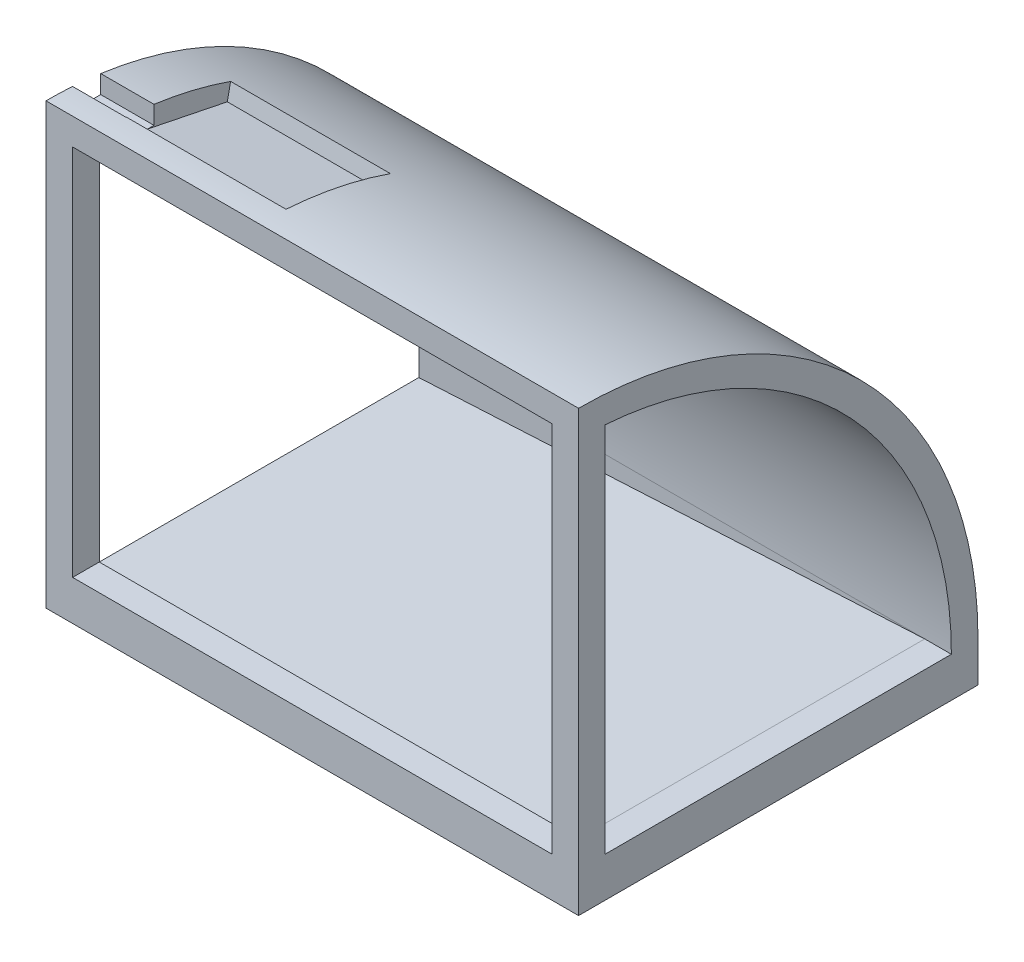
ISO-10303-21;
HEADER;
FILE_DESCRIPTION(('STEP AP214'),'2;1');
FILE_NAME('part.step','',(''),(''),'','','');
FILE_SCHEMA(('AUTOMOTIVE_DESIGN { 1 0 10303 214 1 1 1 1 }'));
ENDSEC;
DATA;
#1=APPLICATION_CONTEXT('core data for automotive mechanical design processes');
#2=APPLICATION_PROTOCOL_DEFINITION('international standard','automotive_design',2000,#1);
#3=PRODUCT_CONTEXT('',#1,'mechanical');
#4=PRODUCT('Part','Part','',(#3));
#5=PRODUCT_RELATED_PRODUCT_CATEGORY('part','',(#4));
#6=PRODUCT_DEFINITION_FORMATION('','',#4);
#7=PRODUCT_DEFINITION_CONTEXT('part definition',#1,'design');
#8=PRODUCT_DEFINITION('design','',#6,#7);
#9=PRODUCT_DEFINITION_SHAPE('','',#8);
#10=(LENGTH_UNIT() NAMED_UNIT(*) SI_UNIT(.MILLI.,.METRE.));
#11=(NAMED_UNIT(*) PLANE_ANGLE_UNIT() SI_UNIT($,.RADIAN.));
#12=(NAMED_UNIT(*) SI_UNIT($,.STERADIAN.) SOLID_ANGLE_UNIT());
#13=UNCERTAINTY_MEASURE_WITH_UNIT(LENGTH_MEASURE(1.E-05),#10,'distance_accuracy_value','');
#14=(GEOMETRIC_REPRESENTATION_CONTEXT(3) GLOBAL_UNCERTAINTY_ASSIGNED_CONTEXT((#13)) GLOBAL_UNIT_ASSIGNED_CONTEXT((#10,
#11,#12)) REPRESENTATION_CONTEXT('',''));
#15=CARTESIAN_POINT('',(0.,0.,0.));
#16=DIRECTION('',(0.,0.,1.));
#17=DIRECTION('',(1.,0.,0.));
#18=AXIS2_PLACEMENT_3D('',#15,#16,#17);
#19=CARTESIAN_POINT('',(-100.,-15.,0.));
#20=DIRECTION('',(-1.,0.,0.));
#21=DIRECTION('',(0.,0.,1.));
#22=AXIS2_PLACEMENT_3D('',#19,#20,#21);
#23=PLANE('',#22);
#24=DIRECTION('',(0.,0.,1.));
#25=VECTOR('',#24,1.);
#26=CARTESIAN_POINT('',(-100.,-10.,-65.));
#27=LINE('',#26,#25);
#28=CARTESIAN_POINT('',(-100.,-10.,-65.));
#29=VERTEX_POINT('',#28);
#30=CARTESIAN_POINT('',(-100.,-10.,65.0000000000001));
#31=VERTEX_POINT('',#30);
#32=EDGE_CURVE('E445',#29,#31,#27,.T.);
#33=ORIENTED_EDGE('',*,*,#32,.F.);
#34=DIRECTION('',(0.,-1.,0.));
#35=VECTOR('',#34,1.);
#36=CARTESIAN_POINT('',(-100.,0.,-65.));
#37=LINE('',#36,#35);
#38=CARTESIAN_POINT('',(-100.,0.,-65.));
#39=VERTEX_POINT('',#38);
#40=EDGE_CURVE('E436',#39,#29,#37,.T.);
#41=ORIENTED_EDGE('',*,*,#40,.F.);
#42=CARTESIAN_POINT('',(-100.,0.,75.));
#43=DIRECTION('',(-1.,0.,0.));
#44=DIRECTION('',(0.,0.,1.));
#45=AXIS2_PLACEMENT_3D('',#42,#43,#44);
#46=CIRCLE('',#45,140.);
#47=CARTESIAN_POINT('',(-100.,139.642400437689,65.0000000000001));
#48=VERTEX_POINT('',#47);
#49=EDGE_CURVE('E519',#48,#39,#46,.T.);
#50=ORIENTED_EDGE('',*,*,#49,.F.);
#51=DIRECTION('',(0.,-1.,0.));
#52=VECTOR('',#51,1.);
#53=CARTESIAN_POINT('',(-100.,150.001,65.0000000000001));
#54=LINE('',#53,#52);
#55=EDGE_CURVE('E497',#48,#31,#54,.T.);
#56=ORIENTED_EDGE('',*,*,#55,.T.);
#57=EDGE_LOOP('',(#33,#41,#50,#56));
#58=FACE_BOUND('',#57,.T.);
#59=CARTESIAN_POINT('',(-100.,0.,75.));
#60=DIRECTION('',(-1.,0.,0.));
#61=DIRECTION('',(0.,0.,1.));
#62=AXIS2_PLACEMENT_3D('',#59,#60,#61);
#63=CIRCLE('',#62,150.);
#64=CARTESIAN_POINT('',(-100.,150.,75.0000000000005));
#65=VERTEX_POINT('',#64);
#66=CARTESIAN_POINT('',(-100.,149.666295470958,65.000000000009));
#67=VERTEX_POINT('',#66);
#68=EDGE_CURVE('E524',#65,#67,#63,.T.);
#69=ORIENTED_EDGE('',*,*,#68,.T.);
#70=DIRECTION('',(0.,-1.,0.));
#71=VECTOR('',#70,1.);
#72=CARTESIAN_POINT('',(-100.,-15.,65.000000000009));
#73=LINE('',#72,#71);
#74=CARTESIAN_POINT('',(-100.,141.751920101458,65.000000000009));
#75=VERTEX_POINT('',#74);
#76=EDGE_CURVE('E392',#67,#75,#73,.T.);
#77=ORIENTED_EDGE('',*,*,#76,.T.);
#78=DIRECTION('',(0.,0.,-1.));
#79=VECTOR('',#78,1.);
#80=CARTESIAN_POINT('',(-100.,141.751920101458,0.));
#81=LINE('',#80,#79);
#82=CARTESIAN_POINT('',(-100.,141.751920101458,54.4540349132148));
#83=VERTEX_POINT('',#82);
#84=EDGE_CURVE('E366',#75,#83,#81,.T.);
#85=ORIENTED_EDGE('',*,*,#84,.T.);
#86=DIRECTION('',(0.,-1.,0.));
#87=VECTOR('',#86,1.);
#88=CARTESIAN_POINT('',(-100.,-15.,54.4540349132148));
#89=LINE('',#88,#87);
#90=CARTESIAN_POINT('',(-100.,148.586215103059,54.4540349132148));
#91=VERTEX_POINT('',#90);
#92=EDGE_CURVE('E370',#91,#83,#89,.T.);
#93=ORIENTED_EDGE('',*,*,#92,.F.);
#94=CARTESIAN_POINT('',(-100.,0.,-75.));
#95=VERTEX_POINT('',#94);
#96=EDGE_CURVE('E523',#91,#95,#63,.T.);
#97=ORIENTED_EDGE('',*,*,#96,.T.);
#98=DIRECTION('',(0.,1.,0.));
#99=VECTOR('',#98,1.);
#100=CARTESIAN_POINT('',(-100.,-15.,-75.));
#101=LINE('',#100,#99);
#102=CARTESIAN_POINT('',(-100.,-15.,-75.));
#103=VERTEX_POINT('',#102);
#104=EDGE_CURVE('E562',#103,#95,#101,.T.);
#105=ORIENTED_EDGE('',*,*,#104,.F.);
#106=DIRECTION('',(0.,0.,1.));
#107=VECTOR('',#106,1.);
#108=CARTESIAN_POINT('',(-100.,-15.,0.));
#109=LINE('',#108,#107);
#110=CARTESIAN_POINT('',(-100.,-15.,75.));
#111=VERTEX_POINT('',#110);
#112=EDGE_CURVE('E548',#103,#111,#109,.T.);
#113=ORIENTED_EDGE('',*,*,#112,.T.);
#114=DIRECTION('',(0.,1.,0.));
#115=VECTOR('',#114,1.);
#116=CARTESIAN_POINT('',(-100.,-15.,75.));
#117=LINE('',#116,#115);
#118=EDGE_CURVE('E556',#111,#65,#117,.T.);
#119=ORIENTED_EDGE('',*,*,#118,.T.);
#120=EDGE_LOOP('',(#69,#77,#85,#93,#97,#105,#113,#119));
#121=FACE_BOUND('',#120,.T.);
#122=ADVANCED_FACE('F205',(#58,#121),#23,.T.);
#123=CARTESIAN_POINT('',(-80.,0.,0.));
#124=DIRECTION('',(-1.,0.,0.));
#125=DIRECTION('',(0.,0.,1.));
#126=AXIS2_PLACEMENT_3D('',#123,#124,#125);
#127=PLANE('',#126);
#128=DIRECTION('',(0.,-1.,0.));
#129=VECTOR('',#128,1.);
#130=CARTESIAN_POINT('',(-80.,0.,65.000000000009));
#131=LINE('',#130,#129);
#132=CARTESIAN_POINT('',(-80.,148.989794855622,65.000000000009));
#133=VERTEX_POINT('',#132);
#134=CARTESIAN_POINT('',(-80.,143.397212025434,65.000000000009));
#135=VERTEX_POINT('',#134);
#136=EDGE_CURVE('E12',#133,#135,#131,.T.);
#137=ORIENTED_EDGE('',*,*,#136,.F.);
#138=DIRECTION('',(0.,0.979795897113272,-0.199999999999997));
#139=VECTOR('',#138,1.);
#140=CARTESIAN_POINT('',(-80.,18.6969384566988,91.5959179422656));
#141=LINE('',#140,#139);
#142=CARTESIAN_POINT('',(-80.,143.620915338641,66.0959179422659));
#143=VERTEX_POINT('',#142);
#144=EDGE_CURVE('E410',#143,#133,#141,.T.);
#145=ORIENTED_EDGE('',*,*,#144,.F.);
#146=DIRECTION('',(0.,-0.199999999999997,-0.979795897113272));
#147=VECTOR('',#146,1.);
#148=CARTESIAN_POINT('',(-80.,124.923976881942,-25.4999999999997));
#149=LINE('',#148,#147);
#150=EDGE_CURVE('E421',#143,#135,#149,.T.);
#151=ORIENTED_EDGE('',*,*,#150,.T.);
#152=EDGE_LOOP('',(#137,#145,#151));
#153=FACE_BOUND('',#152,.T.);
#154=ADVANCED_FACE('F668',(#153),#127,.F.);
#155=DIRECTION('',(0.,0.,1.));
#156=VECTOR('',#155,1.);
#157=CARTESIAN_POINT('',(-80.,141.751920101458,0.));
#158=LINE('',#157,#156);
#159=CARTESIAN_POINT('',(-80.,141.751920101458,54.4540349132148));
#160=VERTEX_POINT('',#159);
#161=CARTESIAN_POINT('',(-80.,141.751920101458,56.9397486166852));
#162=VERTEX_POINT('',#161);
#163=EDGE_CURVE('E221',#160,#162,#158,.T.);
#164=ORIENTED_EDGE('',*,*,#163,.T.);
#165=CARTESIAN_POINT('',(-80.,135.620915338641,26.904082057735));
#166=VERTEX_POINT('',#165);
#167=EDGE_CURVE('E420',#162,#166,#149,.T.);
#168=ORIENTED_EDGE('',*,*,#167,.T.);
#169=DIRECTION('',(0.,0.979795897113272,-0.199999999999997));
#170=VECTOR('',#169,1.);
#171=CARTESIAN_POINT('',(-80.,10.6969384566989,52.4040820577347));
#172=LINE('',#171,#170);
#173=CARTESIAN_POINT('',(-80.,141.657131648265,25.671944563098));
#174=VERTEX_POINT('',#173);
#175=EDGE_CURVE('E229',#166,#174,#172,.T.);
#176=ORIENTED_EDGE('',*,*,#175,.T.);
#177=CARTESIAN_POINT('',(-80.,0.,75.));
#178=DIRECTION('',(-1.,0.,0.));
#179=DIRECTION('',(0.,0.,1.));
#180=AXIS2_PLACEMENT_3D('',#177,#178,#179);
#181=CIRCLE('',#180,150.);
#182=CARTESIAN_POINT('',(-80.,148.586215103059,54.4540349132148));
#183=VERTEX_POINT('',#182);
#184=EDGE_CURVE('E566',#174,#183,#181,.F.);
#185=ORIENTED_EDGE('',*,*,#184,.T.);
#186=DIRECTION('',(0.,1.,0.));
#187=VECTOR('',#186,1.);
#188=CARTESIAN_POINT('',(-80.,0.,54.4540349132148));
#189=LINE('',#188,#187);
#190=EDGE_CURVE('E377',#160,#183,#189,.T.);
#191=ORIENTED_EDGE('',*,*,#190,.F.);
#192=EDGE_LOOP('',(#164,#168,#176,#185,#191));
#193=FACE_BOUND('',#192,.T.);
#194=ADVANCED_FACE('F609',(#193),#127,.F.);
#195=CARTESIAN_POINT('',(-100.,0.,75.));
#196=DIRECTION('',(-1.,0.,0.));
#197=DIRECTION('',(0.,0.,1.));
#198=AXIS2_PLACEMENT_3D('',#195,#196,#197);
#199=CYLINDRICAL_SURFACE('',#198,150.);
#200=DIRECTION('',(-1.,0.,0.));
#201=VECTOR('',#200,1.);
#202=CARTESIAN_POINT('',(-100.,148.586215103059,54.4540349132148));
#203=LINE('',#202,#201);
#204=EDGE_CURVE('E389',#183,#91,#203,.T.);
#205=ORIENTED_EDGE('',*,*,#204,.F.);
#206=ORIENTED_EDGE('',*,*,#184,.F.);
#207=DIRECTION('',(-1.,0.,0.));
#208=VECTOR('',#207,1.);
#209=CARTESIAN_POINT('',(-100.,141.657131648265,25.671944563098));
#210=LINE('',#209,#208);
#211=CARTESIAN_POINT('',(-20.,141.657131648265,25.671944563098));
#212=VERTEX_POINT('',#211);
#213=EDGE_CURVE('E576',#174,#212,#210,.F.);
#214=ORIENTED_EDGE('',*,*,#213,.T.);
#215=CARTESIAN_POINT('',(-20.,0.,75.));
#216=DIRECTION('',(-1.,0.,0.));
#217=DIRECTION('',(0.,0.,1.));
#218=AXIS2_PLACEMENT_3D('',#215,#216,#217);
#219=CIRCLE('',#218,150.);
#220=CARTESIAN_POINT('',(-20.,149.657131648265,64.8637804476289));
#221=VERTEX_POINT('',#220);
#222=EDGE_CURVE('E214',#212,#221,#219,.F.);
#223=ORIENTED_EDGE('',*,*,#222,.T.);
#224=DIRECTION('',(-1.,0.,0.));
#225=VECTOR('',#224,1.);
#226=CARTESIAN_POINT('',(-100.,149.657131648265,64.8637804476289));
#227=LINE('',#226,#225);
#228=CARTESIAN_POINT('',(-80.,149.657131648265,64.8637804476289));
#229=VERTEX_POINT('',#228);
#230=EDGE_CURVE('E580',#229,#221,#227,.F.);
#231=ORIENTED_EDGE('',*,*,#230,.F.);
#232=CARTESIAN_POINT('',(-80.,0.,75.));
#233=DIRECTION('',(-1.,0.,0.));
#234=DIRECTION('',(0.,0.,1.));
#235=AXIS2_PLACEMENT_3D('',#232,#233,#234);
#236=CIRCLE('',#235,150.);
#237=CARTESIAN_POINT('',(-80.,149.666295470958,65.000000000009));
#238=VERTEX_POINT('',#237);
#239=EDGE_CURVE('E401',#229,#238,#236,.F.);
#240=ORIENTED_EDGE('',*,*,#239,.T.);
#241=DIRECTION('',(-1.,0.,0.));
#242=VECTOR('',#241,1.);
#243=CARTESIAN_POINT('',(-100.,149.666295470958,65.000000000009));
#244=LINE('',#243,#242);
#245=EDGE_CURVE('E395',#238,#67,#244,.T.);
#246=ORIENTED_EDGE('',*,*,#245,.T.);
#247=ORIENTED_EDGE('',*,*,#68,.F.);
#248=DIRECTION('',(1.,0.,0.));
#249=VECTOR('',#248,1.);
#250=CARTESIAN_POINT('',(0.,150.,75.0000000000005));
#251=LINE('',#250,#249);
#252=CARTESIAN_POINT('',(100.,150.,75.0000000000005));
#253=VERTEX_POINT('',#252);
#254=EDGE_CURVE('E515',#65,#253,#251,.T.);
#255=ORIENTED_EDGE('',*,*,#254,.T.);
#256=CARTESIAN_POINT('',(100.,0.,75.));
#257=DIRECTION('',(-1.,0.,0.));
#258=DIRECTION('',(0.,0.,1.));
#259=AXIS2_PLACEMENT_3D('',#256,#257,#258);
#260=CIRCLE('',#259,150.);
#261=CARTESIAN_POINT('',(100.,0.,-75.));
#262=VERTEX_POINT('',#261);
#263=EDGE_CURVE('E528',#253,#262,#260,.T.);
#264=ORIENTED_EDGE('',*,*,#263,.T.);
#265=DIRECTION('',(1.,0.,0.));
#266=VECTOR('',#265,1.);
#267=CARTESIAN_POINT('',(0.,0.,-75.));
#268=LINE('',#267,#266);
#269=EDGE_CURVE('E541',#95,#262,#268,.T.);
#270=ORIENTED_EDGE('',*,*,#269,.F.);
#271=ORIENTED_EDGE('',*,*,#96,.F.);
#272=EDGE_LOOP('',(#205,#206,#214,#223,#231,#240,#246,#247,#255,#264,#270,#271));
#273=FACE_BOUND('',#272,.T.);
#274=ADVANCED_FACE('F587',(#273),#199,.T.);
#275=CARTESIAN_POINT('',(0.,0.,0.));
#276=DIRECTION('',(0.,1.,0.));
#277=DIRECTION('',(0.,0.,1.));
#278=AXIS2_PLACEMENT_3D('',#275,#276,#277);
#279=PLANE('',#278);
#280=DIRECTION('',(0.,0.,1.));
#281=VECTOR('',#280,1.);
#282=CARTESIAN_POINT('',(90.,0.,-65.));
#283=LINE('',#282,#281);
#284=CARTESIAN_POINT('',(90.,0.,-65.));
#285=VERTEX_POINT('',#284);
#286=CARTESIAN_POINT('',(90.,0.,65.0000000000001));
#287=VERTEX_POINT('',#286);
#288=EDGE_CURVE('E450',#285,#287,#283,.T.);
#289=ORIENTED_EDGE('',*,*,#288,.T.);
#290=DIRECTION('',(-1.,0.,0.));
#291=VECTOR('',#290,1.);
#292=CARTESIAN_POINT('',(0.,0.,65.));
#293=LINE('',#292,#291);
#294=CARTESIAN_POINT('',(100.,0.,65.));
#295=VERTEX_POINT('',#294);
#296=EDGE_CURVE('E466',#295,#287,#293,.T.);
#297=ORIENTED_EDGE('',*,*,#296,.F.);
#298=DIRECTION('',(0.,0.,1.));
#299=VECTOR('',#298,1.);
#300=CARTESIAN_POINT('',(100.,0.,0.));
#301=LINE('',#300,#299);
#302=CARTESIAN_POINT('',(100.,0.,-65.));
#303=VERTEX_POINT('',#302);
#304=EDGE_CURVE('E555',#303,#295,#301,.T.);
#305=ORIENTED_EDGE('',*,*,#304,.F.);
#306=DIRECTION('',(1.,0.,0.));
#307=VECTOR('',#306,1.);
#308=CARTESIAN_POINT('',(0.,0.,-65.));
#309=LINE('',#308,#307);
#310=EDGE_CURVE('E504',#285,#303,#309,.T.);
#311=ORIENTED_EDGE('',*,*,#310,.F.);
#312=EDGE_LOOP('',(#289,#297,#305,#311));
#313=FACE_BOUND('',#312,.T.);
#314=ADVANCED_FACE('F629',(#313),#279,.T.);
#315=DIRECTION('',(-1.,0.,0.));
#316=VECTOR('',#315,1.);
#317=CARTESIAN_POINT('',(-100.,0.,65.0000000000001));
#318=LINE('',#317,#316);
#319=CARTESIAN_POINT('',(-90.,0.,65.0000000000001));
#320=VERTEX_POINT('',#319);
#321=EDGE_CURVE('E441',#287,#320,#318,.T.);
#322=ORIENTED_EDGE('',*,*,#321,.T.);
#323=DIRECTION('',(0.,0.,-1.));
#324=VECTOR('',#323,1.);
#325=CARTESIAN_POINT('',(-90.0000000000001,0.,1.24900090270331E-13));
#326=LINE('',#325,#324);
#327=CARTESIAN_POINT('',(-90.,0.,75.));
#328=VERTEX_POINT('',#327);
#329=EDGE_CURVE('E485',#328,#320,#326,.T.);
#330=ORIENTED_EDGE('',*,*,#329,.F.);
#331=DIRECTION('',(1.,0.,0.));
#332=VECTOR('',#331,1.);
#333=CARTESIAN_POINT('',(0.,0.,75.));
#334=LINE('',#333,#332);
#335=CARTESIAN_POINT('',(90.,0.,75.));
#336=VERTEX_POINT('',#335);
#337=EDGE_CURVE('E552',#328,#336,#334,.T.);
#338=ORIENTED_EDGE('',*,*,#337,.T.);
#339=DIRECTION('',(0.,0.,-1.));
#340=VECTOR('',#339,1.);
#341=CARTESIAN_POINT('',(89.9999999999999,0.,-1.2490009027033E-13));
#342=LINE('',#341,#340);
#343=EDGE_CURVE('E454',#336,#287,#342,.T.);
#344=ORIENTED_EDGE('',*,*,#343,.T.);
#345=EDGE_LOOP('',(#322,#330,#338,#344));
#346=FACE_BOUND('',#345,.T.);
#347=ADVANCED_FACE('F657',(#346),#279,.T.);
#348=CARTESIAN_POINT('',(-100.,0.,75.));
#349=DIRECTION('',(-1.,0.,0.));
#350=DIRECTION('',(0.,0.,1.));
#351=AXIS2_PLACEMENT_3D('',#348,#349,#350);
#352=CYLINDRICAL_SURFACE('',#351,140.);
#353=DIRECTION('',(-1.,0.,0.));
#354=VECTOR('',#353,1.);
#355=CARTESIAN_POINT('',(-100.,139.642400437689,65.));
#356=LINE('',#355,#354);
#357=CARTESIAN_POINT('',(100.,139.642400437689,65.));
#358=VERTEX_POINT('',#357);
#359=CARTESIAN_POINT('',(90.,139.642400437689,65.));
#360=VERTEX_POINT('',#359);
#361=EDGE_CURVE('E461',#358,#360,#356,.T.);
#362=ORIENTED_EDGE('',*,*,#361,.T.);
#363=CARTESIAN_POINT('',(90.,0.,75.));
#364=DIRECTION('',(-1.,0.,0.));
#365=DIRECTION('',(0.,0.,1.));
#366=AXIS2_PLACEMENT_3D('',#363,#364,#365);
#367=CIRCLE('',#366,140.);
#368=CARTESIAN_POINT('',(90.,140.,75.0000000000005));
#369=VERTEX_POINT('',#368);
#370=EDGE_CURVE('E458',#369,#360,#367,.T.);
#371=ORIENTED_EDGE('',*,*,#370,.F.);
#372=DIRECTION('',(1.,0.,0.));
#373=VECTOR('',#372,1.);
#374=CARTESIAN_POINT('',(0.,140.,75.0000000000005));
#375=LINE('',#374,#373);
#376=CARTESIAN_POINT('',(-90.,140.,75.0000000000005));
#377=VERTEX_POINT('',#376);
#378=EDGE_CURVE('E511',#377,#369,#375,.T.);
#379=ORIENTED_EDGE('',*,*,#378,.F.);
#380=CARTESIAN_POINT('',(-90.,0.,75.));
#381=DIRECTION('',(-1.,0.,0.));
#382=DIRECTION('',(0.,0.,1.));
#383=AXIS2_PLACEMENT_3D('',#380,#381,#382);
#384=CIRCLE('',#383,140.);
#385=CARTESIAN_POINT('',(-90.,139.642400437689,65.0000000000001));
#386=VERTEX_POINT('',#385);
#387=EDGE_CURVE('E500',#377,#386,#384,.T.);
#388=ORIENTED_EDGE('',*,*,#387,.T.);
#389=DIRECTION('',(-1.,0.,0.));
#390=VECTOR('',#389,1.);
#391=CARTESIAN_POINT('',(-100.,139.642400437689,65.0000000000001));
#392=LINE('',#391,#390);
#393=EDGE_CURVE('E489',#48,#386,#392,.F.);
#394=ORIENTED_EDGE('',*,*,#393,.F.);
#395=ORIENTED_EDGE('',*,*,#49,.T.);
#396=EDGE_CURVE('E507',#39,#285,#309,.T.);
#397=ORIENTED_EDGE('',*,*,#396,.T.);
#398=ORIENTED_EDGE('',*,*,#310,.T.);
#399=CARTESIAN_POINT('',(100.,0.,75.));
#400=DIRECTION('',(-1.,0.,0.));
#401=DIRECTION('',(0.,0.,1.));
#402=AXIS2_PLACEMENT_3D('',#399,#400,#401);
#403=CIRCLE('',#402,140.);
#404=EDGE_CURVE('E532',#358,#303,#403,.T.);
#405=ORIENTED_EDGE('',*,*,#404,.F.);
#406=EDGE_LOOP('',(#362,#371,#379,#388,#394,#395,#397,#398,#405));
#407=FACE_BOUND('',#406,.T.);
#408=ADVANCED_FACE('F623',(#407),#352,.F.);
#409=CARTESIAN_POINT('',(100.,-15.,0.));
#410=DIRECTION('',(-1.,0.,0.));
#411=DIRECTION('',(0.,0.,1.));
#412=AXIS2_PLACEMENT_3D('',#409,#410,#411);
#413=PLANE('',#412);
#414=ORIENTED_EDGE('',*,*,#263,.F.);
#415=DIRECTION('',(0.,1.,0.));
#416=VECTOR('',#415,1.);
#417=CARTESIAN_POINT('',(100.,-15.,75.));
#418=LINE('',#417,#416);
#419=CARTESIAN_POINT('',(100.,-15.,75.));
#420=VERTEX_POINT('',#419);
#421=EDGE_CURVE('E536',#420,#253,#418,.T.);
#422=ORIENTED_EDGE('',*,*,#421,.F.);
#423=DIRECTION('',(0.,0.,1.));
#424=VECTOR('',#423,1.);
#425=CARTESIAN_POINT('',(100.,-15.,0.));
#426=LINE('',#425,#424);
#427=CARTESIAN_POINT('',(100.,-15.,-75.));
#428=VERTEX_POINT('',#427);
#429=EDGE_CURVE('E540',#428,#420,#426,.T.);
#430=ORIENTED_EDGE('',*,*,#429,.F.);
#431=DIRECTION('',(0.,1.,0.));
#432=VECTOR('',#431,1.);
#433=CARTESIAN_POINT('',(100.,-15.,-75.));
#434=LINE('',#433,#432);
#435=EDGE_CURVE('E551',#428,#262,#434,.T.);
#436=ORIENTED_EDGE('',*,*,#435,.T.);
#437=EDGE_LOOP('',(#414,#422,#430,#436));
#438=FACE_BOUND('',#437,.T.);
#439=ORIENTED_EDGE('',*,*,#304,.T.);
#440=DIRECTION('',(0.,-1.,0.));
#441=VECTOR('',#440,1.);
#442=CARTESIAN_POINT('',(100.,150.001,65.));
#443=LINE('',#442,#441);
#444=EDGE_CURVE('E474',#358,#295,#443,.T.);
#445=ORIENTED_EDGE('',*,*,#444,.F.);
#446=ORIENTED_EDGE('',*,*,#404,.T.);
#447=EDGE_LOOP('',(#439,#445,#446));
#448=FACE_BOUND('',#447,.T.);
#449=ADVANCED_FACE('F627',(#438,#448),#413,.F.);
#450=CARTESIAN_POINT('',(0.,-15.,75.));
#451=DIRECTION('',(0.,0.,1.));
#452=DIRECTION('',(1.,0.,0.));
#453=AXIS2_PLACEMENT_3D('',#450,#451,#452);
#454=PLANE('',#453);
#455=ORIENTED_EDGE('',*,*,#421,.T.);
#456=ORIENTED_EDGE('',*,*,#254,.F.);
#457=ORIENTED_EDGE('',*,*,#118,.F.);
#458=DIRECTION('',(1.,0.,0.));
#459=VECTOR('',#458,1.);
#460=CARTESIAN_POINT('',(0.,-15.,75.));
#461=LINE('',#460,#459);
#462=EDGE_CURVE('E537',#111,#420,#461,.T.);
#463=ORIENTED_EDGE('',*,*,#462,.T.);
#464=EDGE_LOOP('',(#455,#456,#457,#463));
#465=FACE_BOUND('',#464,.T.);
#466=ORIENTED_EDGE('',*,*,#337,.F.);
#467=DIRECTION('',(0.,-1.,0.));
#468=VECTOR('',#467,1.);
#469=CARTESIAN_POINT('',(-90.,150.001,75.));
#470=LINE('',#469,#468);
#471=EDGE_CURVE('E484',#377,#328,#470,.T.);
#472=ORIENTED_EDGE('',*,*,#471,.F.);
#473=ORIENTED_EDGE('',*,*,#378,.T.);
#474=DIRECTION('',(0.,-1.,0.));
#475=VECTOR('',#474,1.);
#476=CARTESIAN_POINT('',(90.,150.001,75.));
#477=LINE('',#476,#475);
#478=EDGE_CURVE('E462',#369,#336,#477,.T.);
#479=ORIENTED_EDGE('',*,*,#478,.T.);
#480=EDGE_LOOP('',(#466,#472,#473,#479));
#481=FACE_BOUND('',#480,.T.);
#482=ADVANCED_FACE('F207',(#465,#481),#454,.T.);
#483=CARTESIAN_POINT('',(0.,-15.,0.));
#484=DIRECTION('',(0.,1.,0.));
#485=DIRECTION('',(0.,0.,1.));
#486=AXIS2_PLACEMENT_3D('',#483,#484,#485);
#487=PLANE('',#486);
#488=ORIENTED_EDGE('',*,*,#462,.F.);
#489=ORIENTED_EDGE('',*,*,#112,.F.);
#490=DIRECTION('',(1.,0.,0.));
#491=VECTOR('',#490,1.);
#492=CARTESIAN_POINT('',(0.,-15.,-75.));
#493=LINE('',#492,#491);
#494=EDGE_CURVE('E545',#103,#428,#493,.T.);
#495=ORIENTED_EDGE('',*,*,#494,.T.);
#496=ORIENTED_EDGE('',*,*,#429,.T.);
#497=EDGE_LOOP('',(#488,#489,#495,#496));
#498=FACE_BOUND('',#497,.T.);
#499=ADVANCED_FACE('F681',(#498),#487,.F.);
#500=CARTESIAN_POINT('',(0.,-15.,-75.));
#501=DIRECTION('',(0.,0.,1.));
#502=DIRECTION('',(1.,0.,0.));
#503=AXIS2_PLACEMENT_3D('',#500,#501,#502);
#504=PLANE('',#503);
#505=ORIENTED_EDGE('',*,*,#269,.T.);
#506=ORIENTED_EDGE('',*,*,#435,.F.);
#507=ORIENTED_EDGE('',*,*,#494,.F.);
#508=ORIENTED_EDGE('',*,*,#104,.T.);
#509=EDGE_LOOP('',(#505,#506,#507,#508));
#510=FACE_BOUND('',#509,.T.);
#511=ADVANCED_FACE('F679',(#510),#504,.F.);
#512=CARTESIAN_POINT('',(-90.0000000000001,150.001,1.24900090270331E-13));
#513=DIRECTION('',(-1.,0.,0.));
#514=DIRECTION('',(0.,0.,1.));
#515=AXIS2_PLACEMENT_3D('',#512,#513,#514);
#516=PLANE('',#515);
#517=ORIENTED_EDGE('',*,*,#387,.F.);
#518=ORIENTED_EDGE('',*,*,#471,.T.);
#519=ORIENTED_EDGE('',*,*,#329,.T.);
#520=DIRECTION('',(0.,-1.,0.));
#521=VECTOR('',#520,1.);
#522=CARTESIAN_POINT('',(-90.,150.001,65.0000000000001));
#523=LINE('',#522,#521);
#524=EDGE_CURVE('E493',#386,#320,#523,.T.);
#525=ORIENTED_EDGE('',*,*,#524,.F.);
#526=EDGE_LOOP('',(#517,#518,#519,#525));
#527=FACE_BOUND('',#526,.T.);
#528=ADVANCED_FACE('F642',(#527),#516,.F.);
#529=CARTESIAN_POINT('',(0.,150.001,65.0000000000001));
#530=DIRECTION('',(0.,0.,-1.));
#531=DIRECTION('',(-1.,0.,0.));
#532=AXIS2_PLACEMENT_3D('',#529,#530,#531);
#533=PLANE('',#532);
#534=ORIENTED_EDGE('',*,*,#55,.F.);
#535=ORIENTED_EDGE('',*,*,#393,.T.);
#536=ORIENTED_EDGE('',*,*,#524,.T.);
#537=ORIENTED_EDGE('',*,*,#321,.F.);
#538=DIRECTION('',(0.99861782933251,0.0525588331227637,0.));
#539=VECTOR('',#538,1.);
#540=CARTESIAN_POINT('',(-100.,-10.,65.0000000000001));
#541=LINE('',#540,#539);
#542=EDGE_CURVE('E432',#31,#287,#541,.T.);
#543=ORIENTED_EDGE('',*,*,#542,.F.);
#544=EDGE_LOOP('',(#534,#535,#536,#537,#543));
#545=FACE_BOUND('',#544,.T.);
#546=ADVANCED_FACE('F655',(#545),#533,.T.);
#547=CARTESIAN_POINT('',(89.9999999999999,150.001,-1.2490009027033E-13));
#548=DIRECTION('',(-1.,0.,0.));
#549=DIRECTION('',(0.,0.,1.));
#550=AXIS2_PLACEMENT_3D('',#547,#548,#549);
#551=PLANE('',#550);
#552=ORIENTED_EDGE('',*,*,#478,.F.);
#553=ORIENTED_EDGE('',*,*,#370,.T.);
#554=DIRECTION('',(0.,-1.,0.));
#555=VECTOR('',#554,1.);
#556=CARTESIAN_POINT('',(90.,150.001,65.));
#557=LINE('',#556,#555);
#558=EDGE_CURVE('E470',#360,#287,#557,.T.);
#559=ORIENTED_EDGE('',*,*,#558,.T.);
#560=ORIENTED_EDGE('',*,*,#343,.F.);
#561=EDGE_LOOP('',(#552,#553,#559,#560));
#562=FACE_BOUND('',#561,.T.);
#563=ADVANCED_FACE('F658',(#562),#551,.T.);
#564=CARTESIAN_POINT('',(0.,150.001,65.));
#565=DIRECTION('',(0.,0.,1.));
#566=DIRECTION('',(1.,0.,0.));
#567=AXIS2_PLACEMENT_3D('',#564,#565,#566);
#568=PLANE('',#567);
#569=ORIENTED_EDGE('',*,*,#361,.F.);
#570=ORIENTED_EDGE('',*,*,#444,.T.);
#571=ORIENTED_EDGE('',*,*,#296,.T.);
#572=ORIENTED_EDGE('',*,*,#558,.F.);
#573=EDGE_LOOP('',(#569,#570,#571,#572));
#574=FACE_BOUND('',#573,.T.);
#575=ADVANCED_FACE('F632',(#574),#568,.F.);
#576=CARTESIAN_POINT('',(-100.,-10.,-65.));
#577=DIRECTION('',(0.0525588331227637,-0.99861782933251,0.));
#578=DIRECTION('',(0.99861782933251,0.0525588331227637,0.));
#579=AXIS2_PLACEMENT_3D('',#576,#577,#578);
#580=PLANE('',#579);
#581=ORIENTED_EDGE('',*,*,#542,.T.);
#582=ORIENTED_EDGE('',*,*,#288,.F.);
#583=DIRECTION('',(0.99861782933251,0.0525588331227637,0.));
#584=VECTOR('',#583,1.);
#585=CARTESIAN_POINT('',(-100.,-10.,-65.));
#586=LINE('',#585,#584);
#587=EDGE_CURVE('E440',#29,#285,#586,.T.);
#588=ORIENTED_EDGE('',*,*,#587,.F.);
#589=ORIENTED_EDGE('',*,*,#32,.T.);
#590=EDGE_LOOP('',(#581,#582,#588,#589));
#591=FACE_BOUND('',#590,.T.);
#592=ADVANCED_FACE('F652',(#591),#580,.F.);
#593=CARTESIAN_POINT('',(0.,0.,-65.));
#594=DIRECTION('',(0.,0.,1.));
#595=DIRECTION('',(1.,0.,0.));
#596=AXIS2_PLACEMENT_3D('',#593,#594,#595);
#597=PLANE('',#596);
#598=ORIENTED_EDGE('',*,*,#40,.T.);
#599=ORIENTED_EDGE('',*,*,#587,.T.);
#600=ORIENTED_EDGE('',*,*,#396,.F.);
#601=EDGE_LOOP('',(#598,#599,#600));
#602=FACE_BOUND('',#601,.T.);
#603=ADVANCED_FACE('F650',(#602),#597,.T.);
#604=CARTESIAN_POINT('',(-20.,18.6969384566988,91.5959179422656));
#605=DIRECTION('',(0.,0.199999999999997,0.979795897113272));
#606=DIRECTION('',(0.,-0.979795897113272,0.199999999999997));
#607=AXIS2_PLACEMENT_3D('',#604,#605,#606);
#608=PLANE('',#607);
#609=ORIENTED_EDGE('',*,*,#230,.T.);
#610=DIRECTION('',(0.,0.979795897113272,-0.199999999999997));
#611=VECTOR('',#610,1.);
#612=CARTESIAN_POINT('',(-20.,18.6969384566988,91.5959179422656));
#613=LINE('',#612,#611);
#614=CARTESIAN_POINT('',(-20.,143.620915338641,66.0959179422659));
#615=VERTEX_POINT('',#614);
#616=EDGE_CURVE('E413',#615,#221,#613,.T.);
#617=ORIENTED_EDGE('',*,*,#616,.F.);
#618=DIRECTION('',(-1.,0.,0.));
#619=VECTOR('',#618,1.);
#620=CARTESIAN_POINT('',(-20.,143.620915338641,66.0959179422659));
#621=LINE('',#620,#619);
#622=EDGE_CURVE('E429',#615,#143,#621,.T.);
#623=ORIENTED_EDGE('',*,*,#622,.T.);
#624=ORIENTED_EDGE('',*,*,#144,.T.);
#625=EDGE_CURVE('E425',#133,#229,#141,.T.);
#626=ORIENTED_EDGE('',*,*,#625,.T.);
#627=EDGE_LOOP('',(#609,#617,#623,#624,#626));
#628=FACE_BOUND('',#627,.T.);
#629=ADVANCED_FACE('F602',(#628),#608,.F.);
#630=CARTESIAN_POINT('',(-20.,124.923976881942,-25.4999999999997));
#631=DIRECTION('',(0.,0.979795897113272,-0.199999999999997));
#632=DIRECTION('',(0.,0.199999999999997,0.979795897113272));
#633=AXIS2_PLACEMENT_3D('',#630,#631,#632);
#634=PLANE('',#633);
#635=ORIENTED_EDGE('',*,*,#150,.F.);
#636=ORIENTED_EDGE('',*,*,#622,.F.);
#637=DIRECTION('',(0.,-0.199999999999997,-0.979795897113272));
#638=VECTOR('',#637,1.);
#639=CARTESIAN_POINT('',(-20.,124.923976881942,-25.4999999999997));
#640=LINE('',#639,#638);
#641=CARTESIAN_POINT('',(-20.,135.620915338641,26.904082057735));
#642=VERTEX_POINT('',#641);
#643=EDGE_CURVE('E409',#615,#642,#640,.T.);
#644=ORIENTED_EDGE('',*,*,#643,.T.);
#645=DIRECTION('',(-1.,0.,0.));
#646=VECTOR('',#645,1.);
#647=CARTESIAN_POINT('',(-20.,135.620915338641,26.904082057735));
#648=LINE('',#647,#646);
#649=EDGE_CURVE('E417',#642,#166,#648,.T.);
#650=ORIENTED_EDGE('',*,*,#649,.T.);
#651=ORIENTED_EDGE('',*,*,#167,.F.);
#652=EDGE_CURVE('E359',#135,#162,#149,.T.);
#653=ORIENTED_EDGE('',*,*,#652,.F.);
#654=EDGE_LOOP('',(#635,#636,#644,#650,#651,#653));
#655=FACE_BOUND('',#654,.T.);
#656=ADVANCED_FACE('F600',(#655),#634,.T.);
#657=CARTESIAN_POINT('',(-20.,10.6969384566989,52.4040820577347));
#658=DIRECTION('',(0.,0.199999999999997,0.979795897113272));
#659=DIRECTION('',(0.,-0.979795897113272,0.199999999999997));
#660=AXIS2_PLACEMENT_3D('',#657,#658,#659);
#661=PLANE('',#660);
#662=ORIENTED_EDGE('',*,*,#175,.F.);
#663=ORIENTED_EDGE('',*,*,#649,.F.);
#664=DIRECTION('',(0.,0.979795897113272,-0.199999999999997));
#665=VECTOR('',#664,1.);
#666=CARTESIAN_POINT('',(-20.,10.6969384566989,52.4040820577347));
#667=LINE('',#666,#665);
#668=EDGE_CURVE('E405',#642,#212,#667,.T.);
#669=ORIENTED_EDGE('',*,*,#668,.T.);
#670=ORIENTED_EDGE('',*,*,#213,.F.);
#671=EDGE_LOOP('',(#662,#663,#669,#670));
#672=FACE_BOUND('',#671,.T.);
#673=ADVANCED_FACE('F596',(#672),#661,.T.);
#674=CARTESIAN_POINT('',(-20.,0.,0.));
#675=DIRECTION('',(-1.,0.,0.));
#676=DIRECTION('',(0.,0.,1.));
#677=AXIS2_PLACEMENT_3D('',#674,#675,#676);
#678=PLANE('',#677);
#679=ORIENTED_EDGE('',*,*,#668,.F.);
#680=ORIENTED_EDGE('',*,*,#643,.F.);
#681=ORIENTED_EDGE('',*,*,#616,.T.);
#682=ORIENTED_EDGE('',*,*,#222,.F.);
#683=EDGE_LOOP('',(#679,#680,#681,#682));
#684=FACE_BOUND('',#683,.T.);
#685=ADVANCED_FACE('F591',(#684),#678,.T.);
#686=CARTESIAN_POINT('',(-80.,0.,0.));
#687=DIRECTION('',(-1.,0.,0.));
#688=DIRECTION('',(0.,0.,1.));
#689=AXIS2_PLACEMENT_3D('',#686,#687,#688);
#690=PLANE('',#689);
#691=ORIENTED_EDGE('',*,*,#625,.F.);
#692=DIRECTION('',(0.,1.,0.));
#693=VECTOR('',#692,1.);
#694=CARTESIAN_POINT('',(-80.,0.,65.000000000009));
#695=LINE('',#694,#693);
#696=EDGE_CURVE('E378',#133,#238,#695,.T.);
#697=ORIENTED_EDGE('',*,*,#696,.T.);
#698=ORIENTED_EDGE('',*,*,#239,.F.);
#699=EDGE_LOOP('',(#691,#697,#698));
#700=FACE_BOUND('',#699,.T.);
#701=ADVANCED_FACE('F702',(#700),#690,.T.);
#702=CARTESIAN_POINT('',(-154.,141.751920101458,0.));
#703=DIRECTION('',(0.,1.,0.));
#704=DIRECTION('',(0.,0.,1.));
#705=AXIS2_PLACEMENT_3D('',#702,#703,#704);
#706=PLANE('',#705);
#707=DIRECTION('',(1.,0.,0.));
#708=VECTOR('',#707,1.);
#709=CARTESIAN_POINT('',(-154.,141.751920101458,65.000000000009));
#710=LINE('',#709,#708);
#711=CARTESIAN_POINT('',(-80.,141.751920101458,65.000000000009));
#712=VERTEX_POINT('',#711);
#713=EDGE_CURVE('E363',#75,#712,#710,.T.);
#714=ORIENTED_EDGE('',*,*,#713,.T.);
#715=EDGE_CURVE('E353',#162,#712,#158,.T.);
#716=ORIENTED_EDGE('',*,*,#715,.F.);
#717=ORIENTED_EDGE('',*,*,#163,.F.);
#718=DIRECTION('',(1.,0.,0.));
#719=VECTOR('',#718,1.);
#720=CARTESIAN_POINT('',(-154.,141.751920101458,54.4540349132148));
#721=LINE('',#720,#719);
#722=EDGE_CURVE('E371',#83,#160,#721,.T.);
#723=ORIENTED_EDGE('',*,*,#722,.F.);
#724=ORIENTED_EDGE('',*,*,#84,.F.);
#725=EDGE_LOOP('',(#714,#716,#717,#723,#724));
#726=FACE_BOUND('',#725,.T.);
#727=ADVANCED_FACE('F364',(#726),#706,.T.);
#728=CARTESIAN_POINT('',(-154.,0.,65.000000000009));
#729=DIRECTION('',(0.,0.,-1.));
#730=DIRECTION('',(-1.,0.,0.));
#731=AXIS2_PLACEMENT_3D('',#728,#729,#730);
#732=PLANE('',#731);
#733=ORIENTED_EDGE('',*,*,#696,.F.);
#734=ORIENTED_EDGE('',*,*,#136,.T.);
#735=EDGE_CURVE('E357',#712,#135,#695,.T.);
#736=ORIENTED_EDGE('',*,*,#735,.F.);
#737=ORIENTED_EDGE('',*,*,#713,.F.);
#738=ORIENTED_EDGE('',*,*,#76,.F.);
#739=ORIENTED_EDGE('',*,*,#245,.F.);
#740=EDGE_LOOP('',(#733,#734,#736,#737,#738,#739));
#741=FACE_BOUND('',#740,.T.);
#742=ADVANCED_FACE('F374',(#741),#732,.T.);
#743=CARTESIAN_POINT('',(-154.,0.,54.4540349132148));
#744=DIRECTION('',(0.,0.,-1.));
#745=DIRECTION('',(-1.,0.,0.));
#746=AXIS2_PLACEMENT_3D('',#743,#744,#745);
#747=PLANE('',#746);
#748=ORIENTED_EDGE('',*,*,#204,.T.);
#749=ORIENTED_EDGE('',*,*,#92,.T.);
#750=ORIENTED_EDGE('',*,*,#722,.T.);
#751=ORIENTED_EDGE('',*,*,#190,.T.);
#752=EDGE_LOOP('',(#748,#749,#750,#751));
#753=FACE_BOUND('',#752,.T.);
#754=ADVANCED_FACE('F613',(#753),#747,.F.);
#755=ORIENTED_EDGE('',*,*,#715,.T.);
#756=ORIENTED_EDGE('',*,*,#735,.T.);
#757=ORIENTED_EDGE('',*,*,#652,.T.);
#758=EDGE_LOOP('',(#755,#756,#757));
#759=FACE_BOUND('',#758,.T.);
#760=ADVANCED_FACE('F355',(#759),#690,.T.);
#761=CLOSED_SHELL('',(#122,#154,#194,#274,#314,#347,#408,#449,#482,#499,#511,#528,#546,#563,
#575,#592,#603,#629,#656,#673,#685,#701,#727,#742,#754,#760));
#762=MANIFOLD_SOLID_BREP('B2',#761);
#763=ADVANCED_BREP_SHAPE_REPRESENTATION('',(#18,#762),#14);
#764=SHAPE_DEFINITION_REPRESENTATION(#9,#763);
ENDSEC;
END-ISO-10303-21;
